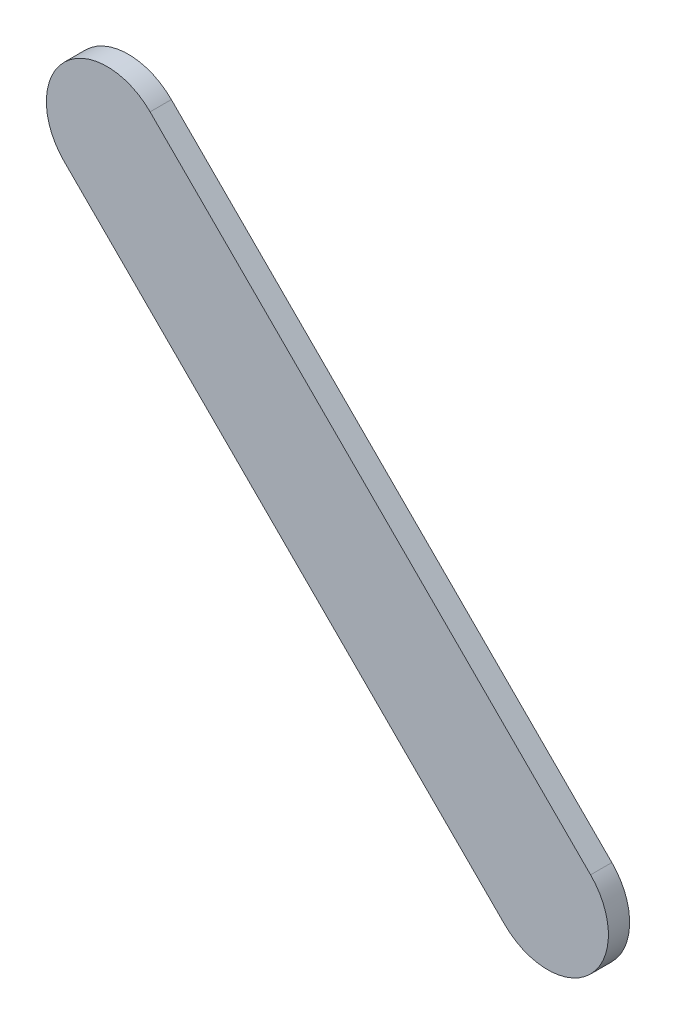
ISO-10303-21;
HEADER;
FILE_DESCRIPTION(('STEP AP214'),'2;1');
FILE_NAME('part.step','',(''),(''),'','','');
FILE_SCHEMA(('AUTOMOTIVE_DESIGN { 1 0 10303 214 1 1 1 1 }'));
ENDSEC;
DATA;
#1=APPLICATION_CONTEXT('core data for automotive mechanical design processes');
#2=APPLICATION_PROTOCOL_DEFINITION('international standard','automotive_design',2000,#1);
#3=PRODUCT_CONTEXT('',#1,'mechanical');
#4=PRODUCT('Part','Part','',(#3));
#5=PRODUCT_RELATED_PRODUCT_CATEGORY('part','',(#4));
#6=PRODUCT_DEFINITION_FORMATION('','',#4);
#7=PRODUCT_DEFINITION_CONTEXT('part definition',#1,'design');
#8=PRODUCT_DEFINITION('design','',#6,#7);
#9=PRODUCT_DEFINITION_SHAPE('','',#8);
#10=(LENGTH_UNIT() NAMED_UNIT(*) SI_UNIT(.MILLI.,.METRE.));
#11=(NAMED_UNIT(*) PLANE_ANGLE_UNIT() SI_UNIT($,.RADIAN.));
#12=(NAMED_UNIT(*) SI_UNIT($,.STERADIAN.) SOLID_ANGLE_UNIT());
#13=UNCERTAINTY_MEASURE_WITH_UNIT(LENGTH_MEASURE(1.E-05),#10,'distance_accuracy_value','');
#14=(GEOMETRIC_REPRESENTATION_CONTEXT(3) GLOBAL_UNCERTAINTY_ASSIGNED_CONTEXT((#13)) GLOBAL_UNIT_ASSIGNED_CONTEXT((#10,
#11,#12)) REPRESENTATION_CONTEXT('',''));
#15=CARTESIAN_POINT('',(0.,0.,0.));
#16=DIRECTION('',(0.,0.,1.));
#17=DIRECTION('',(1.,0.,0.));
#18=AXIS2_PLACEMENT_3D('',#15,#16,#17);
#19=CARTESIAN_POINT('',(84.379289,-115.22071,1.635));
#20=DIRECTION('',(0.,0.,1.));
#21=DIRECTION('',(1.,0.,0.));
#22=AXIS2_PLACEMENT_3D('',#19,#20,#21);
#23=PLANE('',#22);
#24=DIRECTION('',(0.707106781186548,-0.707106781186548,0.));
#25=VECTOR('',#24,1.);
#26=CARTESIAN_POINT('',(84.379289,-115.22071,1.635));
#27=LINE('',#26,#25);
#28=CARTESIAN_POINT('',(84.379289,-115.22071,1.635));
#29=VERTEX_POINT('',#28);
#30=CARTESIAN_POINT('',(85.104289,-115.94571,1.635));
#31=VERTEX_POINT('',#30);
#32=EDGE_CURVE('E82',#29,#31,#27,.T.);
#33=ORIENTED_EDGE('',*,*,#32,.T.);
#34=CARTESIAN_POINT('',(85.1749995,-115.8749995,1.635));
#35=DIRECTION('',(0.,0.,1.));
#36=DIRECTION('',(-0.707106781186548,-0.707106781186548,0.));
#37=AXIS2_PLACEMENT_3D('',#34,#35,#36);
#38=CIRCLE('',#37,0.09999974810219);
#39=CARTESIAN_POINT('',(85.24571,-115.804289,1.635));
#40=VERTEX_POINT('',#39);
#41=EDGE_CURVE('E107',#31,#40,#38,.T.);
#42=ORIENTED_EDGE('',*,*,#41,.T.);
#43=DIRECTION('',(-0.707106781186548,0.707106781186548,0.));
#44=VECTOR('',#43,1.);
#45=CARTESIAN_POINT('',(85.24571,-115.804289,1.635));
#46=LINE('',#45,#44);
#47=CARTESIAN_POINT('',(84.52071,-115.079289,1.635));
#48=VERTEX_POINT('',#47);
#49=EDGE_CURVE('E75',#40,#48,#46,.T.);
#50=ORIENTED_EDGE('',*,*,#49,.T.);
#51=CARTESIAN_POINT('',(84.4499995,-115.1499995,1.635));
#52=DIRECTION('',(0.,0.,1.));
#53=DIRECTION('',(0.707106781186548,0.707106781186548,0.));
#54=AXIS2_PLACEMENT_3D('',#51,#52,#53);
#55=CIRCLE('',#54,0.09999974810218);
#56=EDGE_CURVE('E11',#48,#29,#55,.T.);
#57=ORIENTED_EDGE('',*,*,#56,.T.);
#58=EDGE_LOOP('',(#33,#42,#50,#57));
#59=FACE_BOUND('',#58,.T.);
#60=ADVANCED_FACE('F17',(#59),#23,.T.);
#61=CARTESIAN_POINT('',(84.379289,-115.22071,1.6));
#62=DIRECTION('',(0.,0.,1.));
#63=DIRECTION('',(1.,0.,0.));
#64=AXIS2_PLACEMENT_3D('',#61,#62,#63);
#65=PLANE('',#64);
#66=CARTESIAN_POINT('',(84.4499995,-115.1499995,1.6));
#67=DIRECTION('',(0.,0.,1.));
#68=DIRECTION('',(0.707106781186548,0.707106781186548,0.));
#69=AXIS2_PLACEMENT_3D('',#66,#67,#68);
#70=CIRCLE('',#69,0.09999974810218);
#71=CARTESIAN_POINT('',(84.52071,-115.079289,1.6));
#72=VERTEX_POINT('',#71);
#73=CARTESIAN_POINT('',(84.379289,-115.22071,1.6));
#74=VERTEX_POINT('',#73);
#75=EDGE_CURVE('E20',#72,#74,#70,.T.);
#76=ORIENTED_EDGE('',*,*,#75,.F.);
#77=DIRECTION('',(-0.707106781186548,0.707106781186548,0.));
#78=VECTOR('',#77,1.);
#79=CARTESIAN_POINT('',(85.24571,-115.804289,1.6));
#80=LINE('',#79,#78);
#81=CARTESIAN_POINT('',(85.24571,-115.804289,1.6));
#82=VERTEX_POINT('',#81);
#83=EDGE_CURVE('E111',#82,#72,#80,.T.);
#84=ORIENTED_EDGE('',*,*,#83,.F.);
#85=CARTESIAN_POINT('',(85.1749995,-115.8749995,1.6));
#86=DIRECTION('',(0.,0.,1.));
#87=DIRECTION('',(-0.707106781186548,-0.707106781186548,0.));
#88=AXIS2_PLACEMENT_3D('',#85,#86,#87);
#89=CIRCLE('',#88,0.09999974810219);
#90=CARTESIAN_POINT('',(85.104289,-115.94571,1.6));
#91=VERTEX_POINT('',#90);
#92=EDGE_CURVE('E84',#91,#82,#89,.T.);
#93=ORIENTED_EDGE('',*,*,#92,.F.);
#94=DIRECTION('',(0.707106781186548,-0.707106781186548,0.));
#95=VECTOR('',#94,1.);
#96=CARTESIAN_POINT('',(84.379289,-115.22071,1.6));
#97=LINE('',#96,#95);
#98=EDGE_CURVE('E80',#74,#91,#97,.T.);
#99=ORIENTED_EDGE('',*,*,#98,.F.);
#100=EDGE_LOOP('',(#76,#84,#93,#99));
#101=FACE_BOUND('',#100,.T.);
#102=ADVANCED_FACE('F86',(#101),#65,.F.);
#103=CARTESIAN_POINT('',(84.4499995,-115.1499995,1.6));
#104=DIRECTION('',(0.,0.,-1.));
#105=DIRECTION('',(0.707106781186548,0.707106781186548,0.));
#106=AXIS2_PLACEMENT_3D('',#103,#104,#105);
#107=CYLINDRICAL_SURFACE('',#106,0.09999974810218);
#108=ORIENTED_EDGE('',*,*,#75,.T.);
#109=DIRECTION('',(0.,0.,1.));
#110=VECTOR('',#109,1.);
#111=CARTESIAN_POINT('',(84.379289,-115.22071,1.6));
#112=LINE('',#111,#110);
#113=EDGE_CURVE('E69',#74,#29,#112,.T.);
#114=ORIENTED_EDGE('',*,*,#113,.T.);
#115=ORIENTED_EDGE('',*,*,#56,.F.);
#116=DIRECTION('',(0.,0.,1.));
#117=VECTOR('',#116,1.);
#118=CARTESIAN_POINT('',(84.52071,-115.079289,1.6));
#119=LINE('',#118,#117);
#120=EDGE_CURVE('E72',#72,#48,#119,.T.);
#121=ORIENTED_EDGE('',*,*,#120,.F.);
#122=EDGE_LOOP('',(#108,#114,#115,#121));
#123=FACE_BOUND('',#122,.T.);
#124=ADVANCED_FACE('F68',(#123),#107,.T.);
#125=CARTESIAN_POINT('',(85.24571,-115.804289,1.6));
#126=DIRECTION('',(-0.707106781186548,-0.707106781186548,0.));
#127=DIRECTION('',(-0.707106781186548,0.707106781186548,0.));
#128=AXIS2_PLACEMENT_3D('',#125,#126,#127);
#129=PLANE('',#128);
#130=ORIENTED_EDGE('',*,*,#83,.T.);
#131=ORIENTED_EDGE('',*,*,#120,.T.);
#132=ORIENTED_EDGE('',*,*,#49,.F.);
#133=DIRECTION('',(0.,0.,1.));
#134=VECTOR('',#133,1.);
#135=CARTESIAN_POINT('',(85.24571,-115.804289,1.6));
#136=LINE('',#135,#134);
#137=EDGE_CURVE('E100',#82,#40,#136,.T.);
#138=ORIENTED_EDGE('',*,*,#137,.F.);
#139=EDGE_LOOP('',(#130,#131,#132,#138));
#140=FACE_BOUND('',#139,.T.);
#141=ADVANCED_FACE('F118',(#140),#129,.F.);
#142=CARTESIAN_POINT('',(85.1749995,-115.8749995,1.6));
#143=DIRECTION('',(0.,0.,-1.));
#144=DIRECTION('',(-0.707106781186548,-0.707106781186548,0.));
#145=AXIS2_PLACEMENT_3D('',#142,#143,#144);
#146=CYLINDRICAL_SURFACE('',#145,0.09999974810219);
#147=ORIENTED_EDGE('',*,*,#92,.T.);
#148=ORIENTED_EDGE('',*,*,#137,.T.);
#149=ORIENTED_EDGE('',*,*,#41,.F.);
#150=DIRECTION('',(0.,0.,1.));
#151=VECTOR('',#150,1.);
#152=CARTESIAN_POINT('',(85.104289,-115.94571,1.6));
#153=LINE('',#152,#151);
#154=EDGE_CURVE('E90',#91,#31,#153,.T.);
#155=ORIENTED_EDGE('',*,*,#154,.F.);
#156=EDGE_LOOP('',(#147,#148,#149,#155));
#157=FACE_BOUND('',#156,.T.);
#158=ADVANCED_FACE('F120',(#157),#146,.T.);
#159=CARTESIAN_POINT('',(84.379289,-115.22071,1.6));
#160=DIRECTION('',(0.707106781186548,0.707106781186548,0.));
#161=DIRECTION('',(0.,0.,-1.));
#162=AXIS2_PLACEMENT_3D('',#159,#160,#161);
#163=PLANE('',#162);
#164=ORIENTED_EDGE('',*,*,#98,.T.);
#165=ORIENTED_EDGE('',*,*,#154,.T.);
#166=ORIENTED_EDGE('',*,*,#32,.F.);
#167=ORIENTED_EDGE('',*,*,#113,.F.);
#168=EDGE_LOOP('',(#164,#165,#166,#167));
#169=FACE_BOUND('',#168,.T.);
#170=ADVANCED_FACE('F78',(#169),#163,.F.);
#171=CLOSED_SHELL('',(#60,#102,#124,#141,#158,#170));
#172=MANIFOLD_SOLID_BREP('B1',#171);
#173=ADVANCED_BREP_SHAPE_REPRESENTATION('',(#18,#172),#14);
#174=SHAPE_DEFINITION_REPRESENTATION(#9,#173);
ENDSEC;
END-ISO-10303-21;
